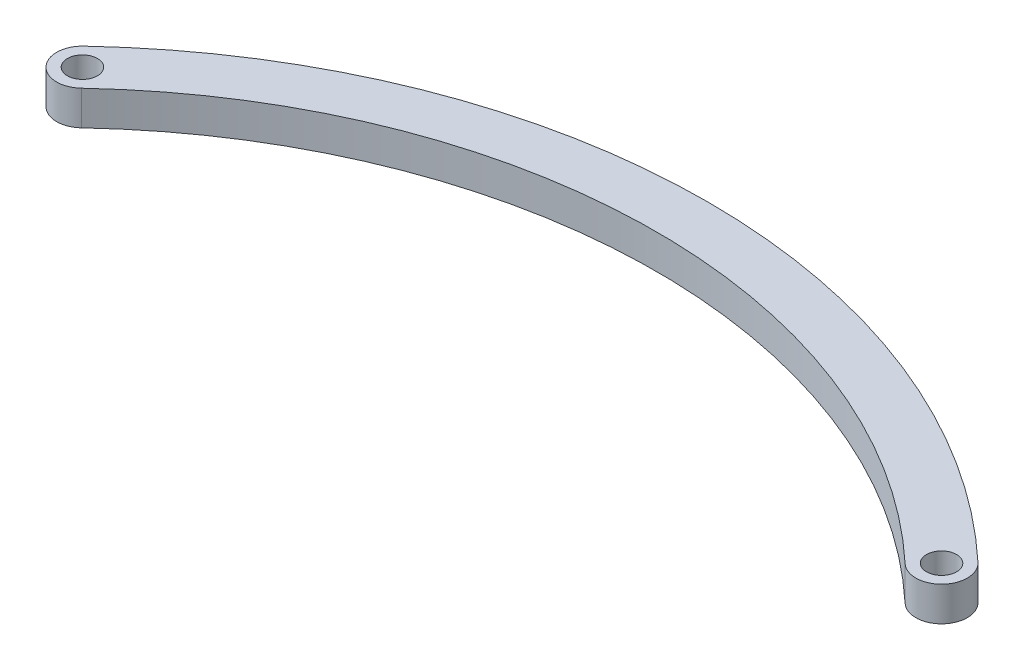
ISO-10303-21;
HEADER;
FILE_DESCRIPTION(('STEP AP214'),'2;1');
FILE_NAME('part.step','',(''),(''),'','','');
FILE_SCHEMA(('AUTOMOTIVE_DESIGN { 1 0 10303 214 1 1 1 1 }'));
ENDSEC;
DATA;
#1=APPLICATION_CONTEXT('core data for automotive mechanical design processes');
#2=APPLICATION_PROTOCOL_DEFINITION('international standard','automotive_design',2000,#1);
#3=PRODUCT_CONTEXT('',#1,'mechanical');
#4=PRODUCT('Part','Part','',(#3));
#5=PRODUCT_RELATED_PRODUCT_CATEGORY('part','',(#4));
#6=PRODUCT_DEFINITION_FORMATION('','',#4);
#7=PRODUCT_DEFINITION_CONTEXT('part definition',#1,'design');
#8=PRODUCT_DEFINITION('design','',#6,#7);
#9=PRODUCT_DEFINITION_SHAPE('','',#8);
#10=(LENGTH_UNIT() NAMED_UNIT(*) SI_UNIT(.MILLI.,.METRE.));
#11=(NAMED_UNIT(*) PLANE_ANGLE_UNIT() SI_UNIT($,.RADIAN.));
#12=(NAMED_UNIT(*) SI_UNIT($,.STERADIAN.) SOLID_ANGLE_UNIT());
#13=UNCERTAINTY_MEASURE_WITH_UNIT(LENGTH_MEASURE(1.E-05),#10,'distance_accuracy_value','');
#14=(GEOMETRIC_REPRESENTATION_CONTEXT(3) GLOBAL_UNCERTAINTY_ASSIGNED_CONTEXT((#13)) GLOBAL_UNIT_ASSIGNED_CONTEXT((#10,
#11,#12)) REPRESENTATION_CONTEXT('',''));
#15=CARTESIAN_POINT('',(0.,0.,0.));
#16=DIRECTION('',(0.,0.,1.));
#17=DIRECTION('',(1.,0.,0.));
#18=AXIS2_PLACEMENT_3D('',#15,#16,#17);
#19=CARTESIAN_POINT('',(0.,4.,53.1883445878888));
#20=DIRECTION('',(0.,-1.,0.));
#21=DIRECTION('',(0.,0.,-1.));
#22=AXIS2_PLACEMENT_3D('',#19,#20,#21);
#23=CYLINDRICAL_SURFACE('',#22,70.);
#24=CARTESIAN_POINT('',(0.,0.,53.1883445878888));
#25=DIRECTION('',(0.,1.,0.));
#26=DIRECTION('',(0.,0.,1.));
#27=AXIS2_PLACEMENT_3D('',#24,#25,#26);
#28=CIRCLE('',#27,70.);
#29=CARTESIAN_POINT('',(47.9452054794521,0.,2.1858223803242));
#30=VERTEX_POINT('',#29);
#31=CARTESIAN_POINT('',(-47.9452054794521,0.,2.1858223803242));
#32=VERTEX_POINT('',#31);
#33=EDGE_CURVE('E106',#30,#32,#28,.T.);
#34=ORIENTED_EDGE('',*,*,#33,.F.);
#35=DIRECTION('',(0.,-1.,0.));
#36=VECTOR('',#35,1.);
#37=CARTESIAN_POINT('',(47.9452054794521,4.,2.1858223803242));
#38=LINE('',#37,#36);
#39=CARTESIAN_POINT('',(47.9452054794521,4.,2.1858223803242));
#40=VERTEX_POINT('',#39);
#41=EDGE_CURVE('E11',#40,#30,#38,.T.);
#42=ORIENTED_EDGE('',*,*,#41,.F.);
#43=CARTESIAN_POINT('',(0.,4.,53.1883445878888));
#44=DIRECTION('',(0.,1.,0.));
#45=DIRECTION('',(0.,0.,1.));
#46=AXIS2_PLACEMENT_3D('',#43,#44,#45);
#47=CIRCLE('',#46,70.);
#48=CARTESIAN_POINT('',(-47.9452054794521,4.,2.1858223803242));
#49=VERTEX_POINT('',#48);
#50=EDGE_CURVE('E88',#40,#49,#47,.T.);
#51=ORIENTED_EDGE('',*,*,#50,.T.);
#52=DIRECTION('',(0.,-1.,0.));
#53=VECTOR('',#52,1.);
#54=CARTESIAN_POINT('',(-47.9452054794521,4.,2.1858223803242));
#55=LINE('',#54,#53);
#56=EDGE_CURVE('E76',#49,#32,#55,.T.);
#57=ORIENTED_EDGE('',*,*,#56,.T.);
#58=EDGE_LOOP('',(#34,#42,#51,#57));
#59=FACE_BOUND('',#58,.T.);
#60=ADVANCED_FACE('F37',(#59),#23,.F.);
#61=CARTESIAN_POINT('',(50.,4.,0.));
#62=DIRECTION('',(0.,-1.,0.));
#63=DIRECTION('',(0.,0.,-1.));
#64=AXIS2_PLACEMENT_3D('',#61,#62,#63);
#65=CYLINDRICAL_SURFACE('',#64,3.);
#66=CARTESIAN_POINT('',(50.,0.,0.));
#67=DIRECTION('',(0.,1.,0.));
#68=DIRECTION('',(0.,0.,1.));
#69=AXIS2_PLACEMENT_3D('',#66,#67,#68);
#70=CIRCLE('',#69,3.);
#71=CARTESIAN_POINT('',(52.0547945205479,0.,-2.1858223803242));
#72=VERTEX_POINT('',#71);
#73=EDGE_CURVE('E93',#30,#72,#70,.T.);
#74=ORIENTED_EDGE('',*,*,#73,.T.);
#75=DIRECTION('',(0.,-1.,0.));
#76=VECTOR('',#75,1.);
#77=CARTESIAN_POINT('',(52.0547945205479,4.,-2.1858223803242));
#78=LINE('',#77,#76);
#79=CARTESIAN_POINT('',(52.0547945205479,4.,-2.1858223803242));
#80=VERTEX_POINT('',#79);
#81=EDGE_CURVE('E45',#80,#72,#78,.T.);
#82=ORIENTED_EDGE('',*,*,#81,.F.);
#83=CARTESIAN_POINT('',(50.,4.,0.));
#84=DIRECTION('',(0.,1.,0.));
#85=DIRECTION('',(0.,0.,1.));
#86=AXIS2_PLACEMENT_3D('',#83,#84,#85);
#87=CIRCLE('',#86,3.);
#88=EDGE_CURVE('E82',#40,#80,#87,.T.);
#89=ORIENTED_EDGE('',*,*,#88,.F.);
#90=ORIENTED_EDGE('',*,*,#41,.T.);
#91=EDGE_LOOP('',(#74,#82,#89,#90));
#92=FACE_BOUND('',#91,.T.);
#93=ADVANCED_FACE('F91',(#92),#65,.T.);
#94=CARTESIAN_POINT('',(0.,4.,53.1883445878888));
#95=DIRECTION('',(0.,-1.,0.));
#96=DIRECTION('',(0.,0.,-1.));
#97=AXIS2_PLACEMENT_3D('',#94,#95,#96);
#98=CYLINDRICAL_SURFACE('',#97,76.);
#99=CARTESIAN_POINT('',(0.,0.,53.1883445878888));
#100=DIRECTION('',(0.,1.,0.));
#101=DIRECTION('',(0.,0.,1.));
#102=AXIS2_PLACEMENT_3D('',#99,#100,#101);
#103=CIRCLE('',#102,76.);
#104=CARTESIAN_POINT('',(-52.0547945205479,0.,-2.1858223803242));
#105=VERTEX_POINT('',#104);
#106=EDGE_CURVE('E69',#72,#105,#103,.T.);
#107=ORIENTED_EDGE('',*,*,#106,.T.);
#108=DIRECTION('',(0.,-1.,0.));
#109=VECTOR('',#108,1.);
#110=CARTESIAN_POINT('',(-52.0547945205479,4.,-2.1858223803242));
#111=LINE('',#110,#109);
#112=CARTESIAN_POINT('',(-52.0547945205479,4.,-2.1858223803242));
#113=VERTEX_POINT('',#112);
#114=EDGE_CURVE('E94',#113,#105,#111,.T.);
#115=ORIENTED_EDGE('',*,*,#114,.F.);
#116=CARTESIAN_POINT('',(0.,4.,53.1883445878888));
#117=DIRECTION('',(0.,1.,0.));
#118=DIRECTION('',(0.,0.,1.));
#119=AXIS2_PLACEMENT_3D('',#116,#117,#118);
#120=CIRCLE('',#119,76.);
#121=EDGE_CURVE('E87',#80,#113,#120,.T.);
#122=ORIENTED_EDGE('',*,*,#121,.F.);
#123=ORIENTED_EDGE('',*,*,#81,.T.);
#124=EDGE_LOOP('',(#107,#115,#122,#123));
#125=FACE_BOUND('',#124,.T.);
#126=ADVANCED_FACE('F95',(#125),#98,.T.);
#127=CARTESIAN_POINT('',(-50.,4.,0.));
#128=DIRECTION('',(0.,-1.,0.));
#129=DIRECTION('',(0.,0.,-1.));
#130=AXIS2_PLACEMENT_3D('',#127,#128,#129);
#131=CYLINDRICAL_SURFACE('',#130,1.75);
#132=CARTESIAN_POINT('',(-50.,4.,0.));
#133=DIRECTION('',(0.,1.,0.));
#134=DIRECTION('',(0.,0.,1.));
#135=AXIS2_PLACEMENT_3D('',#132,#133,#134);
#136=CIRCLE('',#135,1.75);
#137=CARTESIAN_POINT('',(-50.,4.,1.75));
#138=VERTEX_POINT('',#137);
#139=EDGE_CURVE('E97',#138,#138,#136,.T.);
#140=ORIENTED_EDGE('',*,*,#139,.T.);
#141=EDGE_LOOP('',(#140));
#142=FACE_BOUND('',#141,.T.);
#143=CARTESIAN_POINT('',(-50.,0.,0.));
#144=DIRECTION('',(0.,1.,0.));
#145=DIRECTION('',(0.,0.,1.));
#146=AXIS2_PLACEMENT_3D('',#143,#144,#145);
#147=CIRCLE('',#146,1.75);
#148=CARTESIAN_POINT('',(-50.,0.,1.75));
#149=VERTEX_POINT('',#148);
#150=EDGE_CURVE('E113',#149,#149,#147,.T.);
#151=ORIENTED_EDGE('',*,*,#150,.F.);
#152=EDGE_LOOP('',(#151));
#153=FACE_BOUND('',#152,.T.);
#154=ADVANCED_FACE('F133',(#142,#153),#131,.F.);
#155=CARTESIAN_POINT('',(-50.,4.,0.));
#156=DIRECTION('',(0.,-1.,0.));
#157=DIRECTION('',(0.,0.,-1.));
#158=AXIS2_PLACEMENT_3D('',#155,#156,#157);
#159=CYLINDRICAL_SURFACE('',#158,3.);
#160=CARTESIAN_POINT('',(-50.,0.,0.));
#161=DIRECTION('',(0.,1.,0.));
#162=DIRECTION('',(0.,0.,1.));
#163=AXIS2_PLACEMENT_3D('',#160,#161,#162);
#164=CIRCLE('',#163,3.);
#165=EDGE_CURVE('E111',#105,#32,#164,.T.);
#166=ORIENTED_EDGE('',*,*,#165,.T.);
#167=ORIENTED_EDGE('',*,*,#56,.F.);
#168=CARTESIAN_POINT('',(-50.,4.,0.));
#169=DIRECTION('',(0.,1.,0.));
#170=DIRECTION('',(0.,0.,1.));
#171=AXIS2_PLACEMENT_3D('',#168,#169,#170);
#172=CIRCLE('',#171,3.);
#173=EDGE_CURVE('E53',#113,#49,#172,.T.);
#174=ORIENTED_EDGE('',*,*,#173,.F.);
#175=ORIENTED_EDGE('',*,*,#114,.T.);
#176=EDGE_LOOP('',(#166,#167,#174,#175));
#177=FACE_BOUND('',#176,.T.);
#178=ADVANCED_FACE('F122',(#177),#159,.T.);
#179=CARTESIAN_POINT('',(50.,4.,0.));
#180=DIRECTION('',(0.,-1.,0.));
#181=DIRECTION('',(0.,0.,-1.));
#182=AXIS2_PLACEMENT_3D('',#179,#180,#181);
#183=CYLINDRICAL_SURFACE('',#182,1.75);
#184=CARTESIAN_POINT('',(50.,4.,0.));
#185=DIRECTION('',(0.,1.,0.));
#186=DIRECTION('',(0.,0.,1.));
#187=AXIS2_PLACEMENT_3D('',#184,#185,#186);
#188=CIRCLE('',#187,1.75);
#189=CARTESIAN_POINT('',(50.,4.,1.75));
#190=VERTEX_POINT('',#189);
#191=EDGE_CURVE('E103',#190,#190,#188,.T.);
#192=ORIENTED_EDGE('',*,*,#191,.T.);
#193=EDGE_LOOP('',(#192));
#194=FACE_BOUND('',#193,.T.);
#195=CARTESIAN_POINT('',(50.,0.,0.));
#196=DIRECTION('',(0.,1.,0.));
#197=DIRECTION('',(0.,0.,1.));
#198=AXIS2_PLACEMENT_3D('',#195,#196,#197);
#199=CIRCLE('',#198,1.75);
#200=CARTESIAN_POINT('',(50.,0.,1.75));
#201=VERTEX_POINT('',#200);
#202=EDGE_CURVE('E116',#201,#201,#199,.T.);
#203=ORIENTED_EDGE('',*,*,#202,.F.);
#204=EDGE_LOOP('',(#203));
#205=FACE_BOUND('',#204,.T.);
#206=ADVANCED_FACE('F138',(#194,#205),#183,.F.);
#207=CARTESIAN_POINT('',(0.,4.,0.));
#208=DIRECTION('',(0.,1.,0.));
#209=DIRECTION('',(0.,0.,1.));
#210=AXIS2_PLACEMENT_3D('',#207,#208,#209);
#211=PLANE('',#210);
#212=ORIENTED_EDGE('',*,*,#50,.F.);
#213=ORIENTED_EDGE('',*,*,#88,.T.);
#214=ORIENTED_EDGE('',*,*,#121,.T.);
#215=ORIENTED_EDGE('',*,*,#173,.T.);
#216=EDGE_LOOP('',(#212,#213,#214,#215));
#217=FACE_BOUND('',#216,.T.);
#218=ORIENTED_EDGE('',*,*,#139,.F.);
#219=EDGE_LOOP('',(#218));
#220=FACE_BOUND('',#219,.T.);
#221=ORIENTED_EDGE('',*,*,#191,.F.);
#222=EDGE_LOOP('',(#221));
#223=FACE_BOUND('',#222,.T.);
#224=ADVANCED_FACE('F84',(#217,#220,#223),#211,.T.);
#225=CARTESIAN_POINT('',(0.,0.,0.));
#226=DIRECTION('',(0.,1.,0.));
#227=DIRECTION('',(0.,0.,1.));
#228=AXIS2_PLACEMENT_3D('',#225,#226,#227);
#229=PLANE('',#228);
#230=ORIENTED_EDGE('',*,*,#33,.T.);
#231=ORIENTED_EDGE('',*,*,#165,.F.);
#232=ORIENTED_EDGE('',*,*,#106,.F.);
#233=ORIENTED_EDGE('',*,*,#73,.F.);
#234=EDGE_LOOP('',(#230,#231,#232,#233));
#235=FACE_BOUND('',#234,.T.);
#236=ORIENTED_EDGE('',*,*,#150,.T.);
#237=EDGE_LOOP('',(#236));
#238=FACE_BOUND('',#237,.T.);
#239=ORIENTED_EDGE('',*,*,#202,.T.);
#240=EDGE_LOOP('',(#239));
#241=FACE_BOUND('',#240,.T.);
#242=ADVANCED_FACE('F124',(#235,#238,#241),#229,.F.);
#243=CLOSED_SHELL('',(#60,#93,#126,#154,#178,#206,#224,#242));
#244=MANIFOLD_SOLID_BREP('B2',#243);
#245=ADVANCED_BREP_SHAPE_REPRESENTATION('',(#18,#244),#14);
#246=SHAPE_DEFINITION_REPRESENTATION(#9,#245);
ENDSEC;
END-ISO-10303-21;
